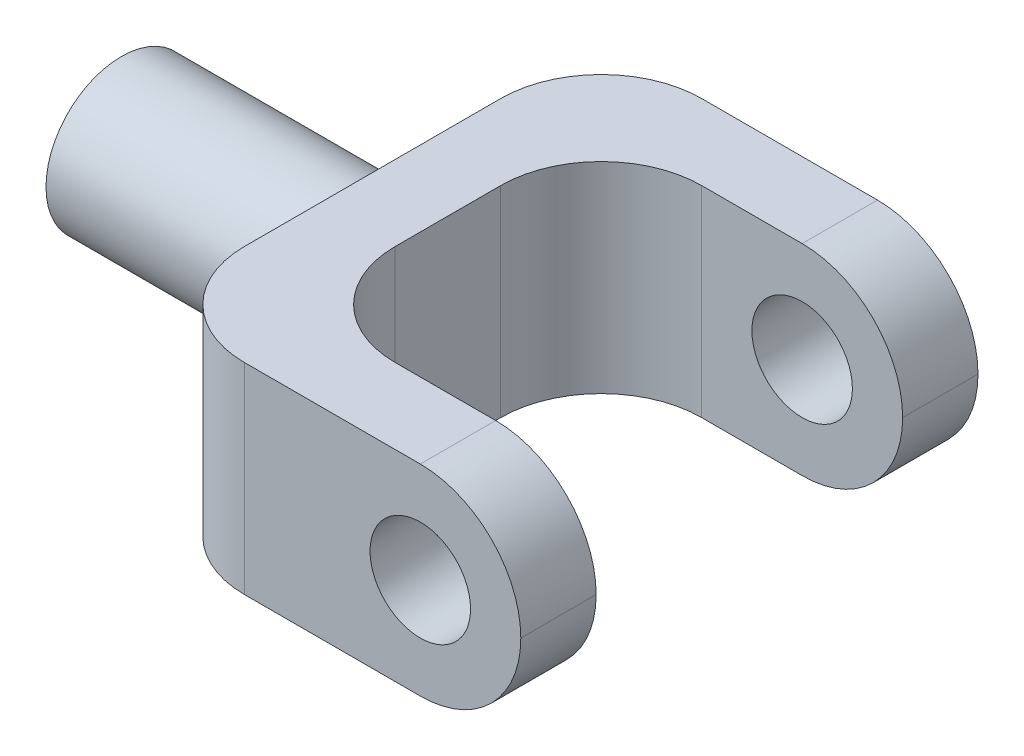
ISO-10303-21;
HEADER;
FILE_DESCRIPTION(('STEP AP214'),'2;1');
FILE_NAME('part.step','',(''),(''),'','','');
FILE_SCHEMA(('AUTOMOTIVE_DESIGN { 1 0 10303 214 1 1 1 1 }'));
ENDSEC;
DATA;
#1=APPLICATION_CONTEXT('core data for automotive mechanical design processes');
#2=APPLICATION_PROTOCOL_DEFINITION('international standard','automotive_design',2000,#1);
#3=PRODUCT_CONTEXT('',#1,'mechanical');
#4=PRODUCT('Part','Part','',(#3));
#5=PRODUCT_RELATED_PRODUCT_CATEGORY('part','',(#4));
#6=PRODUCT_DEFINITION_FORMATION('','',#4);
#7=PRODUCT_DEFINITION_CONTEXT('part definition',#1,'design');
#8=PRODUCT_DEFINITION('design','',#6,#7);
#9=PRODUCT_DEFINITION_SHAPE('','',#8);
#10=(LENGTH_UNIT() NAMED_UNIT(*) SI_UNIT(.MILLI.,.METRE.));
#11=(NAMED_UNIT(*) PLANE_ANGLE_UNIT() SI_UNIT($,.RADIAN.));
#12=(NAMED_UNIT(*) SI_UNIT($,.STERADIAN.) SOLID_ANGLE_UNIT());
#13=UNCERTAINTY_MEASURE_WITH_UNIT(LENGTH_MEASURE(1.E-05),#10,'distance_accuracy_value','');
#14=(GEOMETRIC_REPRESENTATION_CONTEXT(3) GLOBAL_UNCERTAINTY_ASSIGNED_CONTEXT((#13)) GLOBAL_UNIT_ASSIGNED_CONTEXT((#10,
#11,#12)) REPRESENTATION_CONTEXT('',''));
#15=CARTESIAN_POINT('',(0.,0.,0.));
#16=DIRECTION('',(0.,0.,1.));
#17=DIRECTION('',(1.,0.,0.));
#18=AXIS2_PLACEMENT_3D('',#15,#16,#17);
#19=CARTESIAN_POINT('',(1.5,8.,-6.1));
#20=DIRECTION('',(0.,0.,-1.));
#21=DIRECTION('',(-1.,0.,0.));
#22=AXIS2_PLACEMENT_3D('',#19,#20,#21);
#23=PLANE('',#22);
#24=CARTESIAN_POINT('',(9.5,4.,-6.1));
#25=DIRECTION('',(0.,0.,-1.));
#26=DIRECTION('',(-1.,0.,0.));
#27=AXIS2_PLACEMENT_3D('',#24,#25,#26);
#28=CIRCLE('',#27,2.);
#29=CARTESIAN_POINT('',(7.5,4.,-6.1));
#30=VERTEX_POINT('',#29);
#31=EDGE_CURVE('E236',#30,#30,#28,.T.);
#32=ORIENTED_EDGE('',*,*,#31,.T.);
#33=EDGE_LOOP('',(#32));
#34=FACE_BOUND('',#33,.T.);
#35=DIRECTION('',(1.,0.,0.));
#36=VECTOR('',#35,1.);
#37=CARTESIAN_POINT('',(1.5,8.,-6.1));
#38=LINE('',#37,#36);
#39=CARTESIAN_POINT('',(5.5,8.,-6.1));
#40=VERTEX_POINT('',#39);
#41=CARTESIAN_POINT('',(9.5,8.,-6.1));
#42=VERTEX_POINT('',#41);
#43=EDGE_CURVE('E137',#40,#42,#38,.T.);
#44=ORIENTED_EDGE('',*,*,#43,.F.);
#45=DIRECTION('',(0.,-1.,0.));
#46=VECTOR('',#45,1.);
#47=CARTESIAN_POINT('',(5.5,0.,-6.1));
#48=LINE('',#47,#46);
#49=CARTESIAN_POINT('',(5.5,0.,-6.1));
#50=VERTEX_POINT('',#49);
#51=EDGE_CURVE('E198',#40,#50,#48,.T.);
#52=ORIENTED_EDGE('',*,*,#51,.T.);
#53=DIRECTION('',(1.,0.,0.));
#54=VECTOR('',#53,1.);
#55=CARTESIAN_POINT('',(1.5,0.,-6.1));
#56=LINE('',#55,#54);
#57=CARTESIAN_POINT('',(9.5,0.,-6.1));
#58=VERTEX_POINT('',#57);
#59=EDGE_CURVE('E225',#50,#58,#56,.T.);
#60=ORIENTED_EDGE('',*,*,#59,.T.);
#61=CARTESIAN_POINT('',(9.5,4.,-6.1));
#62=DIRECTION('',(0.,0.,-1.));
#63=DIRECTION('',(-1.,0.,0.));
#64=AXIS2_PLACEMENT_3D('',#61,#62,#63);
#65=CIRCLE('',#64,4.);
#66=CARTESIAN_POINT('',(13.5,4.,-6.1));
#67=VERTEX_POINT('',#66);
#68=EDGE_CURVE('E153',#58,#67,#65,.F.);
#69=ORIENTED_EDGE('',*,*,#68,.T.);
#70=CARTESIAN_POINT('',(9.5,4.,-6.1));
#71=DIRECTION('',(0.,0.,-1.));
#72=DIRECTION('',(-1.,0.,0.));
#73=AXIS2_PLACEMENT_3D('',#70,#71,#72);
#74=CIRCLE('',#73,4.);
#75=EDGE_CURVE('E151',#67,#42,#74,.F.);
#76=ORIENTED_EDGE('',*,*,#75,.T.);
#77=EDGE_LOOP('',(#44,#52,#60,#69,#76));
#78=FACE_BOUND('',#77,.T.);
#79=ADVANCED_FACE('F35',(#34,#78),#23,.F.);
#80=CARTESIAN_POINT('',(13.5,8.,-9.1));
#81=DIRECTION('',(0.,0.,1.));
#82=DIRECTION('',(1.,0.,0.));
#83=AXIS2_PLACEMENT_3D('',#80,#81,#82);
#84=PLANE('',#83);
#85=CARTESIAN_POINT('',(9.5,4.,-9.1));
#86=DIRECTION('',(0.,0.,1.));
#87=DIRECTION('',(1.,0.,0.));
#88=AXIS2_PLACEMENT_3D('',#85,#86,#87);
#89=CIRCLE('',#88,2.);
#90=CARTESIAN_POINT('',(11.5,4.,-9.1));
#91=VERTEX_POINT('',#90);
#92=EDGE_CURVE('E267',#91,#91,#89,.T.);
#93=ORIENTED_EDGE('',*,*,#92,.T.);
#94=EDGE_LOOP('',(#93));
#95=FACE_BOUND('',#94,.T.);
#96=DIRECTION('',(-1.,0.,0.));
#97=VECTOR('',#96,1.);
#98=CARTESIAN_POINT('',(13.5,0.,-9.1));
#99=LINE('',#98,#97);
#100=CARTESIAN_POINT('',(9.5,0.,-9.1));
#101=VERTEX_POINT('',#100);
#102=CARTESIAN_POINT('',(2.5,0.,-9.1));
#103=VERTEX_POINT('',#102);
#104=EDGE_CURVE('E235',#101,#103,#99,.T.);
#105=ORIENTED_EDGE('',*,*,#104,.T.);
#106=DIRECTION('',(0.,-1.,0.));
#107=VECTOR('',#106,1.);
#108=CARTESIAN_POINT('',(2.5,8.,-9.1));
#109=LINE('',#108,#107);
#110=CARTESIAN_POINT('',(2.5,8.,-9.1));
#111=VERTEX_POINT('',#110);
#112=EDGE_CURVE('E58',#103,#111,#109,.F.);
#113=ORIENTED_EDGE('',*,*,#112,.T.);
#114=DIRECTION('',(-1.,0.,0.));
#115=VECTOR('',#114,1.);
#116=CARTESIAN_POINT('',(13.5,8.,-9.1));
#117=LINE('',#116,#115);
#118=CARTESIAN_POINT('',(9.5,8.,-9.1));
#119=VERTEX_POINT('',#118);
#120=EDGE_CURVE('E147',#119,#111,#117,.T.);
#121=ORIENTED_EDGE('',*,*,#120,.F.);
#122=CARTESIAN_POINT('',(9.5,4.,-9.1));
#123=DIRECTION('',(0.,0.,1.));
#124=DIRECTION('',(1.,0.,0.));
#125=AXIS2_PLACEMENT_3D('',#122,#123,#124);
#126=CIRCLE('',#125,4.);
#127=CARTESIAN_POINT('',(13.5,4.,-9.1));
#128=VERTEX_POINT('',#127);
#129=EDGE_CURVE('E160',#119,#128,#126,.F.);
#130=ORIENTED_EDGE('',*,*,#129,.T.);
#131=CARTESIAN_POINT('',(9.5,4.,-9.1));
#132=DIRECTION('',(0.,0.,1.));
#133=DIRECTION('',(1.,0.,0.));
#134=AXIS2_PLACEMENT_3D('',#131,#132,#133);
#135=CIRCLE('',#134,4.);
#136=EDGE_CURVE('E161',#128,#101,#135,.F.);
#137=ORIENTED_EDGE('',*,*,#136,.T.);
#138=EDGE_LOOP('',(#105,#113,#121,#130,#137));
#139=FACE_BOUND('',#138,.T.);
#140=ADVANCED_FACE('F243',(#95,#139),#84,.F.);
#141=CARTESIAN_POINT('',(-1.5,8.,-9.1));
#142=DIRECTION('',(1.,0.,0.));
#143=DIRECTION('',(0.,0.,-1.));
#144=AXIS2_PLACEMENT_3D('',#141,#142,#143);
#145=PLANE('',#144);
#146=CARTESIAN_POINT('',(-1.5,4.,0.));
#147=DIRECTION('',(1.,0.,0.));
#148=DIRECTION('',(0.,0.,-1.));
#149=AXIS2_PLACEMENT_3D('',#146,#147,#148);
#150=CIRCLE('',#149,3.);
#151=CARTESIAN_POINT('',(-1.5,4.,-3.));
#152=VERTEX_POINT('',#151);
#153=EDGE_CURVE('E165',#152,#152,#150,.F.);
#154=ORIENTED_EDGE('',*,*,#153,.F.);
#155=EDGE_LOOP('',(#154));
#156=FACE_BOUND('',#155,.T.);
#157=DIRECTION('',(0.,0.,1.));
#158=VECTOR('',#157,1.);
#159=CARTESIAN_POINT('',(-1.5,8.,-9.1));
#160=LINE('',#159,#158);
#161=CARTESIAN_POINT('',(-1.5,8.,-5.1));
#162=VERTEX_POINT('',#161);
#163=CARTESIAN_POINT('',(-1.5,8.,5.1));
#164=VERTEX_POINT('',#163);
#165=EDGE_CURVE('E245',#162,#164,#160,.T.);
#166=ORIENTED_EDGE('',*,*,#165,.F.);
#167=DIRECTION('',(0.,-1.,0.));
#168=VECTOR('',#167,1.);
#169=CARTESIAN_POINT('',(-1.5,8.,-5.1));
#170=LINE('',#169,#168);
#171=CARTESIAN_POINT('',(-1.5,0.,-5.1));
#172=VERTEX_POINT('',#171);
#173=EDGE_CURVE('E202',#162,#172,#170,.T.);
#174=ORIENTED_EDGE('',*,*,#173,.T.);
#175=DIRECTION('',(0.,0.,1.));
#176=VECTOR('',#175,1.);
#177=CARTESIAN_POINT('',(-1.5,0.,-9.1));
#178=LINE('',#177,#176);
#179=CARTESIAN_POINT('',(-1.5,0.,5.1));
#180=VERTEX_POINT('',#179);
#181=EDGE_CURVE('E258',#172,#180,#178,.T.);
#182=ORIENTED_EDGE('',*,*,#181,.T.);
#183=DIRECTION('',(0.,-1.,0.));
#184=VECTOR('',#183,1.);
#185=CARTESIAN_POINT('',(-1.5,8.,5.1));
#186=LINE('',#185,#184);
#187=EDGE_CURVE('E200',#180,#164,#186,.F.);
#188=ORIENTED_EDGE('',*,*,#187,.T.);
#189=EDGE_LOOP('',(#166,#174,#182,#188));
#190=FACE_BOUND('',#189,.T.);
#191=ADVANCED_FACE('F273',(#156,#190),#145,.F.);
#192=CARTESIAN_POINT('',(13.5,8.,9.1));
#193=DIRECTION('',(0.,0.,-1.));
#194=DIRECTION('',(-1.,0.,0.));
#195=AXIS2_PLACEMENT_3D('',#192,#193,#194);
#196=PLANE('',#195);
#197=CARTESIAN_POINT('',(9.5,4.,9.1));
#198=DIRECTION('',(0.,0.,1.));
#199=DIRECTION('',(1.,0.,0.));
#200=AXIS2_PLACEMENT_3D('',#197,#198,#199);
#201=CIRCLE('',#200,2.);
#202=CARTESIAN_POINT('',(11.5,4.,9.1));
#203=VERTEX_POINT('',#202);
#204=EDGE_CURVE('E475',#203,#203,#201,.T.);
#205=ORIENTED_EDGE('',*,*,#204,.F.);
#206=EDGE_LOOP('',(#205));
#207=FACE_BOUND('',#206,.T.);
#208=DIRECTION('',(1.,0.,0.));
#209=VECTOR('',#208,1.);
#210=CARTESIAN_POINT('',(13.5,8.,9.1));
#211=LINE('',#210,#209);
#212=CARTESIAN_POINT('',(2.5,8.,9.1));
#213=VERTEX_POINT('',#212);
#214=CARTESIAN_POINT('',(9.5,8.,9.1));
#215=VERTEX_POINT('',#214);
#216=EDGE_CURVE('E247',#213,#215,#211,.T.);
#217=ORIENTED_EDGE('',*,*,#216,.F.);
#218=DIRECTION('',(0.,-1.,0.));
#219=VECTOR('',#218,1.);
#220=CARTESIAN_POINT('',(2.5,8.,9.1));
#221=LINE('',#220,#219);
#222=CARTESIAN_POINT('',(2.5,0.,9.1));
#223=VERTEX_POINT('',#222);
#224=EDGE_CURVE('E213',#213,#223,#221,.T.);
#225=ORIENTED_EDGE('',*,*,#224,.T.);
#226=DIRECTION('',(1.,0.,0.));
#227=VECTOR('',#226,1.);
#228=CARTESIAN_POINT('',(13.5,0.,9.1));
#229=LINE('',#228,#227);
#230=CARTESIAN_POINT('',(9.5,0.,9.1));
#231=VERTEX_POINT('',#230);
#232=EDGE_CURVE('E261',#223,#231,#229,.T.);
#233=ORIENTED_EDGE('',*,*,#232,.T.);
#234=CARTESIAN_POINT('',(9.5,4.,9.1));
#235=DIRECTION('',(0.,0.,-1.));
#236=DIRECTION('',(-1.,0.,0.));
#237=AXIS2_PLACEMENT_3D('',#234,#235,#236);
#238=CIRCLE('',#237,4.);
#239=CARTESIAN_POINT('',(13.5,4.,9.1));
#240=VERTEX_POINT('',#239);
#241=EDGE_CURVE('E183',#231,#240,#238,.F.);
#242=ORIENTED_EDGE('',*,*,#241,.T.);
#243=CARTESIAN_POINT('',(9.5,4.,9.1));
#244=DIRECTION('',(0.,0.,-1.));
#245=DIRECTION('',(-1.,0.,0.));
#246=AXIS2_PLACEMENT_3D('',#243,#244,#245);
#247=CIRCLE('',#246,4.);
#248=EDGE_CURVE('E180',#240,#215,#247,.F.);
#249=ORIENTED_EDGE('',*,*,#248,.T.);
#250=EDGE_LOOP('',(#217,#225,#233,#242,#249));
#251=FACE_BOUND('',#250,.T.);
#252=ADVANCED_FACE('F276',(#207,#251),#196,.F.);
#253=CARTESIAN_POINT('',(1.5,8.,6.1));
#254=DIRECTION('',(0.,0.,1.));
#255=DIRECTION('',(1.,0.,0.));
#256=AXIS2_PLACEMENT_3D('',#253,#254,#255);
#257=PLANE('',#256);
#258=CARTESIAN_POINT('',(9.5,4.,6.1));
#259=DIRECTION('',(0.,0.,1.));
#260=DIRECTION('',(1.,0.,0.));
#261=AXIS2_PLACEMENT_3D('',#258,#259,#260);
#262=CIRCLE('',#261,2.);
#263=CARTESIAN_POINT('',(11.5,4.,6.1));
#264=VERTEX_POINT('',#263);
#265=EDGE_CURVE('E265',#264,#264,#262,.T.);
#266=ORIENTED_EDGE('',*,*,#265,.T.);
#267=EDGE_LOOP('',(#266));
#268=FACE_BOUND('',#267,.T.);
#269=DIRECTION('',(-1.,0.,0.));
#270=VECTOR('',#269,1.);
#271=CARTESIAN_POINT('',(1.5,0.,6.1));
#272=LINE('',#271,#270);
#273=CARTESIAN_POINT('',(9.5,0.,6.1));
#274=VERTEX_POINT('',#273);
#275=CARTESIAN_POINT('',(5.5,0.,6.1));
#276=VERTEX_POINT('',#275);
#277=EDGE_CURVE('E232',#274,#276,#272,.T.);
#278=ORIENTED_EDGE('',*,*,#277,.T.);
#279=DIRECTION('',(0.,-1.,0.));
#280=VECTOR('',#279,1.);
#281=CARTESIAN_POINT('',(5.5,8.,6.1));
#282=LINE('',#281,#280);
#283=CARTESIAN_POINT('',(5.5,8.,6.1));
#284=VERTEX_POINT('',#283);
#285=EDGE_CURVE('E196',#276,#284,#282,.F.);
#286=ORIENTED_EDGE('',*,*,#285,.T.);
#287=DIRECTION('',(-1.,0.,0.));
#288=VECTOR('',#287,1.);
#289=CARTESIAN_POINT('',(1.5,8.,6.1));
#290=LINE('',#289,#288);
#291=CARTESIAN_POINT('',(9.5,8.,6.1));
#292=VERTEX_POINT('',#291);
#293=EDGE_CURVE('E252',#292,#284,#290,.T.);
#294=ORIENTED_EDGE('',*,*,#293,.F.);
#295=CARTESIAN_POINT('',(9.5,4.,6.1));
#296=DIRECTION('',(0.,0.,1.));
#297=DIRECTION('',(1.,0.,0.));
#298=AXIS2_PLACEMENT_3D('',#295,#296,#297);
#299=CIRCLE('',#298,4.);
#300=CARTESIAN_POINT('',(13.5,4.,6.1));
#301=VERTEX_POINT('',#300);
#302=EDGE_CURVE('E176',#292,#301,#299,.F.);
#303=ORIENTED_EDGE('',*,*,#302,.T.);
#304=CARTESIAN_POINT('',(9.5,4.,6.1));
#305=DIRECTION('',(0.,0.,1.));
#306=DIRECTION('',(1.,0.,0.));
#307=AXIS2_PLACEMENT_3D('',#304,#305,#306);
#308=CIRCLE('',#307,4.);
#309=EDGE_CURVE('E178',#301,#274,#308,.F.);
#310=ORIENTED_EDGE('',*,*,#309,.T.);
#311=EDGE_LOOP('',(#278,#286,#294,#303,#310));
#312=FACE_BOUND('',#311,.T.);
#313=ADVANCED_FACE('F302',(#268,#312),#257,.F.);
#314=CARTESIAN_POINT('',(1.5,8.,6.1));
#315=DIRECTION('',(-1.,0.,0.));
#316=DIRECTION('',(0.,0.,1.));
#317=AXIS2_PLACEMENT_3D('',#314,#315,#316);
#318=PLANE('',#317);
#319=DIRECTION('',(0.,0.,-1.));
#320=VECTOR('',#319,1.);
#321=CARTESIAN_POINT('',(1.5,8.,6.1));
#322=LINE('',#321,#320);
#323=CARTESIAN_POINT('',(1.5,8.,2.1));
#324=VERTEX_POINT('',#323);
#325=CARTESIAN_POINT('',(1.5,8.,-2.1));
#326=VERTEX_POINT('',#325);
#327=EDGE_CURVE('E255',#324,#326,#322,.T.);
#328=ORIENTED_EDGE('',*,*,#327,.F.);
#329=DIRECTION('',(0.,-1.,0.));
#330=VECTOR('',#329,1.);
#331=CARTESIAN_POINT('',(1.5,0.,2.1));
#332=LINE('',#331,#330);
#333=CARTESIAN_POINT('',(1.5,0.,2.1));
#334=VERTEX_POINT('',#333);
#335=EDGE_CURVE('E193',#324,#334,#332,.T.);
#336=ORIENTED_EDGE('',*,*,#335,.T.);
#337=DIRECTION('',(0.,0.,-1.));
#338=VECTOR('',#337,1.);
#339=CARTESIAN_POINT('',(1.5,0.,6.1));
#340=LINE('',#339,#338);
#341=CARTESIAN_POINT('',(1.5,0.,-2.1));
#342=VERTEX_POINT('',#341);
#343=EDGE_CURVE('E148',#334,#342,#340,.T.);
#344=ORIENTED_EDGE('',*,*,#343,.T.);
#345=DIRECTION('',(0.,-1.,0.));
#346=VECTOR('',#345,1.);
#347=CARTESIAN_POINT('',(1.5,8.,-2.1));
#348=LINE('',#347,#346);
#349=EDGE_CURVE('E185',#342,#326,#348,.F.);
#350=ORIENTED_EDGE('',*,*,#349,.T.);
#351=EDGE_LOOP('',(#328,#336,#344,#350));
#352=FACE_BOUND('',#351,.T.);
#353=ADVANCED_FACE('F230',(#352),#318,.F.);
#354=CARTESIAN_POINT('',(0.,8.,0.));
#355=DIRECTION('',(0.,1.,0.));
#356=DIRECTION('',(0.,0.,1.));
#357=AXIS2_PLACEMENT_3D('',#354,#355,#356);
#358=PLANE('',#357);
#359=ORIENTED_EDGE('',*,*,#120,.T.);
#360=CARTESIAN_POINT('',(2.5,8.,-5.1));
#361=DIRECTION('',(0.,1.,0.));
#362=DIRECTION('',(0.,0.,1.));
#363=AXIS2_PLACEMENT_3D('',#360,#361,#362);
#364=CIRCLE('',#363,4.);
#365=EDGE_CURVE('E211',#111,#162,#364,.T.);
#366=ORIENTED_EDGE('',*,*,#365,.T.);
#367=ORIENTED_EDGE('',*,*,#165,.T.);
#368=CARTESIAN_POINT('',(2.5,8.,5.1));
#369=DIRECTION('',(0.,1.,0.));
#370=DIRECTION('',(0.,0.,1.));
#371=AXIS2_PLACEMENT_3D('',#368,#369,#370);
#372=CIRCLE('',#371,4.);
#373=EDGE_CURVE('E50',#164,#213,#372,.T.);
#374=ORIENTED_EDGE('',*,*,#373,.T.);
#375=ORIENTED_EDGE('',*,*,#216,.T.);
#376=DIRECTION('',(0.,0.,-1.));
#377=VECTOR('',#376,1.);
#378=CARTESIAN_POINT('',(9.5,8.,6.1));
#379=LINE('',#378,#377);
#380=EDGE_CURVE('E162',#215,#292,#379,.T.);
#381=ORIENTED_EDGE('',*,*,#380,.T.);
#382=ORIENTED_EDGE('',*,*,#293,.T.);
#383=CARTESIAN_POINT('',(5.5,8.,2.1));
#384=DIRECTION('',(0.,1.,0.));
#385=DIRECTION('',(0.,0.,1.));
#386=AXIS2_PLACEMENT_3D('',#383,#384,#385);
#387=CIRCLE('',#386,4.);
#388=EDGE_CURVE('E218',#284,#324,#387,.F.);
#389=ORIENTED_EDGE('',*,*,#388,.T.);
#390=ORIENTED_EDGE('',*,*,#327,.T.);
#391=CARTESIAN_POINT('',(5.5,8.,-2.1));
#392=DIRECTION('',(0.,1.,0.));
#393=DIRECTION('',(0.,0.,1.));
#394=AXIS2_PLACEMENT_3D('',#391,#392,#393);
#395=CIRCLE('',#394,4.);
#396=EDGE_CURVE('E11',#326,#40,#395,.F.);
#397=ORIENTED_EDGE('',*,*,#396,.T.);
#398=ORIENTED_EDGE('',*,*,#43,.T.);
#399=DIRECTION('',(0.,0.,-1.));
#400=VECTOR('',#399,1.);
#401=CARTESIAN_POINT('',(9.5,8.,-9.1));
#402=LINE('',#401,#400);
#403=EDGE_CURVE('E141',#42,#119,#402,.T.);
#404=ORIENTED_EDGE('',*,*,#403,.T.);
#405=EDGE_LOOP('',(#359,#366,#367,#374,#375,#381,#382,#389,#390,#397,#398,#404));
#406=FACE_BOUND('',#405,.T.);
#407=ADVANCED_FACE('F139',(#406),#358,.T.);
#408=CARTESIAN_POINT('',(0.,0.,0.));
#409=DIRECTION('',(0.,1.,0.));
#410=DIRECTION('',(0.,0.,1.));
#411=AXIS2_PLACEMENT_3D('',#408,#409,#410);
#412=PLANE('',#411);
#413=ORIENTED_EDGE('',*,*,#181,.F.);
#414=CARTESIAN_POINT('',(2.5,0.,-5.1));
#415=DIRECTION('',(0.,1.,0.));
#416=DIRECTION('',(0.,0.,1.));
#417=AXIS2_PLACEMENT_3D('',#414,#415,#416);
#418=CIRCLE('',#417,4.);
#419=EDGE_CURVE('E207',#172,#103,#418,.F.);
#420=ORIENTED_EDGE('',*,*,#419,.T.);
#421=ORIENTED_EDGE('',*,*,#104,.F.);
#422=DIRECTION('',(0.,0.,-1.));
#423=VECTOR('',#422,1.);
#424=CARTESIAN_POINT('',(9.5,0.,0.));
#425=LINE('',#424,#423);
#426=EDGE_CURVE('E173',#101,#58,#425,.F.);
#427=ORIENTED_EDGE('',*,*,#426,.T.);
#428=ORIENTED_EDGE('',*,*,#59,.F.);
#429=CARTESIAN_POINT('',(5.5,0.,-2.1));
#430=DIRECTION('',(0.,1.,0.));
#431=DIRECTION('',(0.,0.,1.));
#432=AXIS2_PLACEMENT_3D('',#429,#430,#431);
#433=CIRCLE('',#432,4.);
#434=EDGE_CURVE('E43',#50,#342,#433,.T.);
#435=ORIENTED_EDGE('',*,*,#434,.T.);
#436=ORIENTED_EDGE('',*,*,#343,.F.);
#437=CARTESIAN_POINT('',(5.5,0.,2.1));
#438=DIRECTION('',(0.,1.,0.));
#439=DIRECTION('',(0.,0.,1.));
#440=AXIS2_PLACEMENT_3D('',#437,#438,#439);
#441=CIRCLE('',#440,4.);
#442=EDGE_CURVE('E216',#334,#276,#441,.T.);
#443=ORIENTED_EDGE('',*,*,#442,.T.);
#444=ORIENTED_EDGE('',*,*,#277,.F.);
#445=DIRECTION('',(0.,0.,-1.));
#446=VECTOR('',#445,1.);
#447=CARTESIAN_POINT('',(9.5,0.,0.));
#448=LINE('',#447,#446);
#449=EDGE_CURVE('E157',#274,#231,#448,.F.);
#450=ORIENTED_EDGE('',*,*,#449,.T.);
#451=ORIENTED_EDGE('',*,*,#232,.F.);
#452=CARTESIAN_POINT('',(2.5,0.,5.1));
#453=DIRECTION('',(0.,1.,0.));
#454=DIRECTION('',(0.,0.,1.));
#455=AXIS2_PLACEMENT_3D('',#452,#453,#454);
#456=CIRCLE('',#455,4.);
#457=EDGE_CURVE('E205',#223,#180,#456,.F.);
#458=ORIENTED_EDGE('',*,*,#457,.T.);
#459=EDGE_LOOP('',(#413,#420,#421,#427,#428,#435,#436,#443,#444,#450,#451,#458));
#460=FACE_BOUND('',#459,.T.);
#461=ADVANCED_FACE('F224',(#460),#412,.F.);
#462=CARTESIAN_POINT('',(9.5,4.,-9.1));
#463=DIRECTION('',(0.,0.,1.));
#464=DIRECTION('',(1.,0.,0.));
#465=AXIS2_PLACEMENT_3D('',#462,#463,#464);
#466=CYLINDRICAL_SURFACE('',#465,2.);
#467=ORIENTED_EDGE('',*,*,#204,.T.);
#468=EDGE_LOOP('',(#467));
#469=FACE_BOUND('',#468,.T.);
#470=ORIENTED_EDGE('',*,*,#265,.F.);
#471=EDGE_LOOP('',(#470));
#472=FACE_BOUND('',#471,.T.);
#473=ADVANCED_FACE('F397',(#469,#472),#466,.F.);
#474=ORIENTED_EDGE('',*,*,#92,.F.);
#475=EDGE_LOOP('',(#474));
#476=FACE_BOUND('',#475,.T.);
#477=ORIENTED_EDGE('',*,*,#31,.F.);
#478=EDGE_LOOP('',(#477));
#479=FACE_BOUND('',#478,.T.);
#480=ADVANCED_FACE('F430',(#476,#479),#466,.F.);
#481=CARTESIAN_POINT('',(-11.5,4.,0.));
#482=DIRECTION('',(1.,0.,0.));
#483=DIRECTION('',(0.,0.,-1.));
#484=AXIS2_PLACEMENT_3D('',#481,#482,#483);
#485=CYLINDRICAL_SURFACE('',#484,3.);
#486=CARTESIAN_POINT('',(-11.5,4.,0.));
#487=DIRECTION('',(-1.,0.,0.));
#488=DIRECTION('',(0.,0.,1.));
#489=AXIS2_PLACEMENT_3D('',#486,#487,#488);
#490=CIRCLE('',#489,3.);
#491=CARTESIAN_POINT('',(-11.5,4.,3.));
#492=VERTEX_POINT('',#491);
#493=EDGE_CURVE('E188',#492,#492,#490,.T.);
#494=ORIENTED_EDGE('',*,*,#493,.F.);
#495=EDGE_LOOP('',(#494));
#496=FACE_BOUND('',#495,.T.);
#497=ORIENTED_EDGE('',*,*,#153,.T.);
#498=EDGE_LOOP('',(#497));
#499=FACE_BOUND('',#498,.T.);
#500=ADVANCED_FACE('F271',(#496,#499),#485,.T.);
#501=CARTESIAN_POINT('',(-11.5,4.,0.));
#502=DIRECTION('',(-1.,0.,0.));
#503=DIRECTION('',(0.,0.,1.));
#504=AXIS2_PLACEMENT_3D('',#501,#502,#503);
#505=PLANE('',#504);
#506=ORIENTED_EDGE('',*,*,#493,.T.);
#507=EDGE_LOOP('',(#506));
#508=FACE_BOUND('',#507,.T.);
#509=ADVANCED_FACE('F328',(#508),#505,.T.);
#510=CARTESIAN_POINT('',(9.5,4.,-6.1));
#511=DIRECTION('',(0.,0.,-1.));
#512=DIRECTION('',(-1.,0.,0.));
#513=AXIS2_PLACEMENT_3D('',#510,#511,#512);
#514=CYLINDRICAL_SURFACE('',#513,4.);
#515=DIRECTION('',(0.,0.,-1.));
#516=VECTOR('',#515,1.);
#517=CARTESIAN_POINT('',(13.5,4.,-6.1));
#518=LINE('',#517,#516);
#519=EDGE_CURVE('E186',#67,#128,#518,.T.);
#520=ORIENTED_EDGE('',*,*,#519,.F.);
#521=ORIENTED_EDGE('',*,*,#68,.F.);
#522=ORIENTED_EDGE('',*,*,#426,.F.);
#523=ORIENTED_EDGE('',*,*,#136,.F.);
#524=EDGE_LOOP('',(#520,#521,#522,#523));
#525=FACE_BOUND('',#524,.T.);
#526=ADVANCED_FACE('F242',(#525),#514,.T.);
#527=CARTESIAN_POINT('',(9.5,4.,0.));
#528=DIRECTION('',(0.,0.,1.));
#529=DIRECTION('',(1.,0.,0.));
#530=AXIS2_PLACEMENT_3D('',#527,#528,#529);
#531=CYLINDRICAL_SURFACE('',#530,4.);
#532=ORIENTED_EDGE('',*,*,#75,.F.);
#533=ORIENTED_EDGE('',*,*,#519,.T.);
#534=ORIENTED_EDGE('',*,*,#129,.F.);
#535=ORIENTED_EDGE('',*,*,#403,.F.);
#536=EDGE_LOOP('',(#532,#533,#534,#535));
#537=FACE_BOUND('',#536,.T.);
#538=ADVANCED_FACE('F159',(#537),#531,.T.);
#539=CARTESIAN_POINT('',(9.5,4.,0.));
#540=DIRECTION('',(0.,0.,1.));
#541=DIRECTION('',(1.,0.,0.));
#542=AXIS2_PLACEMENT_3D('',#539,#540,#541);
#543=CYLINDRICAL_SURFACE('',#542,4.);
#544=ORIENTED_EDGE('',*,*,#380,.F.);
#545=ORIENTED_EDGE('',*,*,#248,.F.);
#546=DIRECTION('',(0.,0.,-1.));
#547=VECTOR('',#546,1.);
#548=CARTESIAN_POINT('',(13.5,4.,9.1));
#549=LINE('',#548,#547);
#550=EDGE_CURVE('E189',#301,#240,#549,.F.);
#551=ORIENTED_EDGE('',*,*,#550,.F.);
#552=ORIENTED_EDGE('',*,*,#302,.F.);
#553=EDGE_LOOP('',(#544,#545,#551,#552));
#554=FACE_BOUND('',#553,.T.);
#555=ADVANCED_FACE('F297',(#554),#543,.T.);
#556=CARTESIAN_POINT('',(9.5,4.,6.1));
#557=DIRECTION('',(0.,0.,-1.));
#558=DIRECTION('',(-1.,0.,0.));
#559=AXIS2_PLACEMENT_3D('',#556,#557,#558);
#560=CYLINDRICAL_SURFACE('',#559,4.);
#561=ORIENTED_EDGE('',*,*,#241,.F.);
#562=ORIENTED_EDGE('',*,*,#449,.F.);
#563=ORIENTED_EDGE('',*,*,#309,.F.);
#564=ORIENTED_EDGE('',*,*,#550,.T.);
#565=EDGE_LOOP('',(#561,#562,#563,#564));
#566=FACE_BOUND('',#565,.T.);
#567=ADVANCED_FACE('F292',(#566),#560,.T.);
#568=CARTESIAN_POINT('',(5.5,8.,2.1));
#569=DIRECTION('',(0.,1.,0.));
#570=DIRECTION('',(0.,0.,1.));
#571=AXIS2_PLACEMENT_3D('',#568,#569,#570);
#572=CYLINDRICAL_SURFACE('',#571,4.);
#573=ORIENTED_EDGE('',*,*,#388,.F.);
#574=ORIENTED_EDGE('',*,*,#285,.F.);
#575=ORIENTED_EDGE('',*,*,#442,.F.);
#576=ORIENTED_EDGE('',*,*,#335,.F.);
#577=EDGE_LOOP('',(#573,#574,#575,#576));
#578=FACE_BOUND('',#577,.T.);
#579=ADVANCED_FACE('F305',(#578),#572,.F.);
#580=CARTESIAN_POINT('',(5.5,8.,-2.1));
#581=DIRECTION('',(0.,1.,0.));
#582=DIRECTION('',(0.,0.,1.));
#583=AXIS2_PLACEMENT_3D('',#580,#581,#582);
#584=CYLINDRICAL_SURFACE('',#583,4.);
#585=ORIENTED_EDGE('',*,*,#396,.F.);
#586=ORIENTED_EDGE('',*,*,#349,.F.);
#587=ORIENTED_EDGE('',*,*,#434,.F.);
#588=ORIENTED_EDGE('',*,*,#51,.F.);
#589=EDGE_LOOP('',(#585,#586,#587,#588));
#590=FACE_BOUND('',#589,.T.);
#591=ADVANCED_FACE('F234',(#590),#584,.F.);
#592=CARTESIAN_POINT('',(2.5,8.,-5.1));
#593=DIRECTION('',(0.,-1.,0.));
#594=DIRECTION('',(0.,0.,-1.));
#595=AXIS2_PLACEMENT_3D('',#592,#593,#594);
#596=CYLINDRICAL_SURFACE('',#595,4.);
#597=ORIENTED_EDGE('',*,*,#365,.F.);
#598=ORIENTED_EDGE('',*,*,#112,.F.);
#599=ORIENTED_EDGE('',*,*,#419,.F.);
#600=ORIENTED_EDGE('',*,*,#173,.F.);
#601=EDGE_LOOP('',(#597,#598,#599,#600));
#602=FACE_BOUND('',#601,.T.);
#603=ADVANCED_FACE('F282',(#602),#596,.T.);
#604=CARTESIAN_POINT('',(2.5,8.,5.1));
#605=DIRECTION('',(0.,-1.,0.));
#606=DIRECTION('',(0.,0.,-1.));
#607=AXIS2_PLACEMENT_3D('',#604,#605,#606);
#608=CYLINDRICAL_SURFACE('',#607,4.);
#609=ORIENTED_EDGE('',*,*,#373,.F.);
#610=ORIENTED_EDGE('',*,*,#187,.F.);
#611=ORIENTED_EDGE('',*,*,#457,.F.);
#612=ORIENTED_EDGE('',*,*,#224,.F.);
#613=EDGE_LOOP('',(#609,#610,#611,#612));
#614=FACE_BOUND('',#613,.T.);
#615=ADVANCED_FACE('F37',(#614),#608,.T.);
#616=CLOSED_SHELL('',(#79,#140,#191,#252,#313,#353,#407,#461,#473,#480,#500,#509,#526,#538,#555,
#567,#579,#591,#603,#615));
#617=MANIFOLD_SOLID_BREP('B2',#616);
#618=ADVANCED_BREP_SHAPE_REPRESENTATION('',(#18,#617),#14);
#619=SHAPE_DEFINITION_REPRESENTATION(#9,#618);
ENDSEC;
END-ISO-10303-21;
